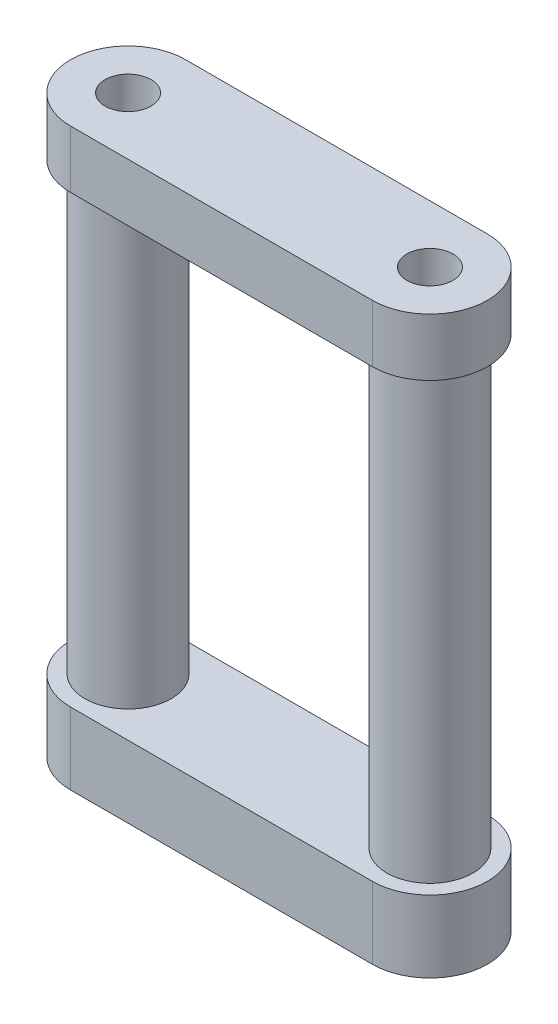
ISO-10303-21;
HEADER;
FILE_DESCRIPTION(('STEP AP214'),'2;1');
FILE_NAME('part.step','',(''),(''),'','','');
FILE_SCHEMA(('AUTOMOTIVE_DESIGN { 1 0 10303 214 1 1 1 1 }'));
ENDSEC;
DATA;
#1=APPLICATION_CONTEXT('core data for automotive mechanical design processes');
#2=APPLICATION_PROTOCOL_DEFINITION('international standard','automotive_design',2000,#1);
#3=PRODUCT_CONTEXT('',#1,'mechanical');
#4=PRODUCT('Part','Part','',(#3));
#5=PRODUCT_RELATED_PRODUCT_CATEGORY('part','',(#4));
#6=PRODUCT_DEFINITION_FORMATION('','',#4);
#7=PRODUCT_DEFINITION_CONTEXT('part definition',#1,'design');
#8=PRODUCT_DEFINITION('design','',#6,#7);
#9=PRODUCT_DEFINITION_SHAPE('','',#8);
#10=(LENGTH_UNIT() NAMED_UNIT(*) SI_UNIT(.MILLI.,.METRE.));
#11=(NAMED_UNIT(*) PLANE_ANGLE_UNIT() SI_UNIT($,.RADIAN.));
#12=(NAMED_UNIT(*) SI_UNIT($,.STERADIAN.) SOLID_ANGLE_UNIT());
#13=UNCERTAINTY_MEASURE_WITH_UNIT(LENGTH_MEASURE(1.E-05),#10,'distance_accuracy_value','');
#14=(GEOMETRIC_REPRESENTATION_CONTEXT(3) GLOBAL_UNCERTAINTY_ASSIGNED_CONTEXT((#13)) GLOBAL_UNIT_ASSIGNED_CONTEXT((#10,
#11,#12)) REPRESENTATION_CONTEXT('',''));
#15=CARTESIAN_POINT('',(0.,0.,0.));
#16=DIRECTION('',(0.,0.,1.));
#17=DIRECTION('',(1.,0.,0.));
#18=AXIS2_PLACEMENT_3D('',#15,#16,#17);
#19=CARTESIAN_POINT('',(-10.5,40.,0.));
#20=DIRECTION('',(0.,1.,0.));
#21=DIRECTION('',(0.,0.,1.));
#22=AXIS2_PLACEMENT_3D('',#19,#20,#21);
#23=PLANE('',#22);
#24=CARTESIAN_POINT('',(10.5,40.,0.));
#25=DIRECTION('',(0.,1.,0.));
#26=DIRECTION('',(0.,0.,1.));
#27=AXIS2_PLACEMENT_3D('',#24,#25,#26);
#28=CIRCLE('',#27,1.6);
#29=CARTESIAN_POINT('',(10.5,40.,1.6));
#30=VERTEX_POINT('',#29);
#31=EDGE_CURVE('E111',#30,#30,#28,.T.);
#32=ORIENTED_EDGE('',*,*,#31,.F.);
#33=EDGE_LOOP('',(#32));
#34=FACE_BOUND('',#33,.T.);
#35=CARTESIAN_POINT('',(-10.5,40.,0.));
#36=DIRECTION('',(0.,1.,0.));
#37=DIRECTION('',(0.,0.,1.));
#38=AXIS2_PLACEMENT_3D('',#35,#36,#37);
#39=CIRCLE('',#38,4.);
#40=CARTESIAN_POINT('',(-10.5,40.,-4.));
#41=VERTEX_POINT('',#40);
#42=CARTESIAN_POINT('',(-10.5,40.,4.));
#43=VERTEX_POINT('',#42);
#44=EDGE_CURVE('E96',#41,#43,#39,.T.);
#45=ORIENTED_EDGE('',*,*,#44,.T.);
#46=DIRECTION('',(1.,0.,0.));
#47=VECTOR('',#46,1.);
#48=CARTESIAN_POINT('',(-10.5,40.,4.));
#49=LINE('',#48,#47);
#50=CARTESIAN_POINT('',(10.5,40.,4.));
#51=VERTEX_POINT('',#50);
#52=EDGE_CURVE('E91',#43,#51,#49,.T.);
#53=ORIENTED_EDGE('',*,*,#52,.T.);
#54=CARTESIAN_POINT('',(10.5,40.,0.));
#55=DIRECTION('',(0.,1.,0.));
#56=DIRECTION('',(0.,0.,1.));
#57=AXIS2_PLACEMENT_3D('',#54,#55,#56);
#58=CIRCLE('',#57,4.);
#59=CARTESIAN_POINT('',(10.5,40.,-4.00000000000001));
#60=VERTEX_POINT('',#59);
#61=EDGE_CURVE('E94',#51,#60,#58,.T.);
#62=ORIENTED_EDGE('',*,*,#61,.T.);
#63=DIRECTION('',(-1.,0.,0.));
#64=VECTOR('',#63,1.);
#65=CARTESIAN_POINT('',(10.5,40.,-4.00000000000001));
#66=LINE('',#65,#64);
#67=EDGE_CURVE('E61',#60,#41,#66,.T.);
#68=ORIENTED_EDGE('',*,*,#67,.T.);
#69=EDGE_LOOP('',(#45,#53,#62,#68));
#70=FACE_BOUND('',#69,.T.);
#71=CARTESIAN_POINT('',(-10.5,40.,0.));
#72=DIRECTION('',(0.,1.,0.));
#73=DIRECTION('',(0.,0.,1.));
#74=AXIS2_PLACEMENT_3D('',#71,#72,#73);
#75=CIRCLE('',#74,1.6);
#76=CARTESIAN_POINT('',(-10.5,40.,1.6));
#77=VERTEX_POINT('',#76);
#78=EDGE_CURVE('E126',#77,#77,#75,.T.);
#79=ORIENTED_EDGE('',*,*,#78,.F.);
#80=EDGE_LOOP('',(#79));
#81=FACE_BOUND('',#80,.T.);
#82=ADVANCED_FACE('F44',(#34,#70,#81),#23,.T.);
#83=CARTESIAN_POINT('',(-10.5,36.,0.));
#84=DIRECTION('',(0.,1.,0.));
#85=DIRECTION('',(0.,0.,1.));
#86=AXIS2_PLACEMENT_3D('',#83,#84,#85);
#87=PLANE('',#86);
#88=CARTESIAN_POINT('',(-10.5,36.,0.));
#89=DIRECTION('',(0.,1.,0.));
#90=DIRECTION('',(0.,0.,1.));
#91=AXIS2_PLACEMENT_3D('',#88,#89,#90);
#92=CIRCLE('',#91,4.);
#93=CARTESIAN_POINT('',(-10.5,36.,-4.));
#94=VERTEX_POINT('',#93);
#95=CARTESIAN_POINT('',(-10.5,36.,4.));
#96=VERTEX_POINT('',#95);
#97=EDGE_CURVE('E108',#94,#96,#92,.T.);
#98=ORIENTED_EDGE('',*,*,#97,.F.);
#99=DIRECTION('',(-1.,0.,0.));
#100=VECTOR('',#99,1.);
#101=CARTESIAN_POINT('',(10.5,36.,-4.00000000000001));
#102=LINE('',#101,#100);
#103=CARTESIAN_POINT('',(10.5,36.,-4.00000000000001));
#104=VERTEX_POINT('',#103);
#105=EDGE_CURVE('E84',#104,#94,#102,.T.);
#106=ORIENTED_EDGE('',*,*,#105,.F.);
#107=CARTESIAN_POINT('',(10.5,36.,0.));
#108=DIRECTION('',(0.,1.,0.));
#109=DIRECTION('',(0.,0.,1.));
#110=AXIS2_PLACEMENT_3D('',#107,#108,#109);
#111=CIRCLE('',#110,4.);
#112=CARTESIAN_POINT('',(10.5,36.,4.));
#113=VERTEX_POINT('',#112);
#114=EDGE_CURVE('E78',#113,#104,#111,.T.);
#115=ORIENTED_EDGE('',*,*,#114,.F.);
#116=DIRECTION('',(1.,0.,0.));
#117=VECTOR('',#116,1.);
#118=CARTESIAN_POINT('',(-10.5,36.,4.));
#119=LINE('',#118,#117);
#120=EDGE_CURVE('E100',#96,#113,#119,.T.);
#121=ORIENTED_EDGE('',*,*,#120,.F.);
#122=EDGE_LOOP('',(#98,#106,#115,#121));
#123=FACE_BOUND('',#122,.T.);
#124=CARTESIAN_POINT('',(10.5,36.,0.));
#125=DIRECTION('',(0.,1.,0.));
#126=DIRECTION('',(0.,0.,1.));
#127=AXIS2_PLACEMENT_3D('',#124,#125,#126);
#128=CIRCLE('',#127,1.6);
#129=CARTESIAN_POINT('',(10.5,36.,1.6));
#130=VERTEX_POINT('',#129);
#131=EDGE_CURVE('E123',#130,#130,#128,.T.);
#132=ORIENTED_EDGE('',*,*,#131,.T.);
#133=EDGE_LOOP('',(#132));
#134=FACE_BOUND('',#133,.T.);
#135=CARTESIAN_POINT('',(-10.5,36.,0.));
#136=DIRECTION('',(0.,1.,0.));
#137=DIRECTION('',(0.,0.,1.));
#138=AXIS2_PLACEMENT_3D('',#135,#136,#137);
#139=CIRCLE('',#138,1.6);
#140=CARTESIAN_POINT('',(-10.5,36.,1.6));
#141=VERTEX_POINT('',#140);
#142=EDGE_CURVE('E129',#141,#141,#139,.T.);
#143=ORIENTED_EDGE('',*,*,#142,.T.);
#144=EDGE_LOOP('',(#143));
#145=FACE_BOUND('',#144,.T.);
#146=ADVANCED_FACE('F119',(#123,#134,#145),#87,.F.);
#147=CARTESIAN_POINT('',(-10.5,40.,0.));
#148=DIRECTION('',(0.,-1.,0.));
#149=DIRECTION('',(0.,0.,-1.));
#150=AXIS2_PLACEMENT_3D('',#147,#148,#149);
#151=CYLINDRICAL_SURFACE('',#150,4.);
#152=ORIENTED_EDGE('',*,*,#97,.T.);
#153=DIRECTION('',(0.,-1.,0.));
#154=VECTOR('',#153,1.);
#155=CARTESIAN_POINT('',(-10.5,40.,4.));
#156=LINE('',#155,#154);
#157=EDGE_CURVE('E12',#43,#96,#156,.T.);
#158=ORIENTED_EDGE('',*,*,#157,.F.);
#159=ORIENTED_EDGE('',*,*,#44,.F.);
#160=DIRECTION('',(0.,-1.,0.));
#161=VECTOR('',#160,1.);
#162=CARTESIAN_POINT('',(-10.5,40.,-4.));
#163=LINE('',#162,#161);
#164=EDGE_CURVE('E104',#41,#94,#163,.T.);
#165=ORIENTED_EDGE('',*,*,#164,.T.);
#166=EDGE_LOOP('',(#152,#158,#159,#165));
#167=FACE_BOUND('',#166,.T.);
#168=ADVANCED_FACE('F46',(#167),#151,.T.);
#169=CARTESIAN_POINT('',(-10.5,40.,4.));
#170=DIRECTION('',(0.,0.,-1.));
#171=DIRECTION('',(-1.,0.,0.));
#172=AXIS2_PLACEMENT_3D('',#169,#170,#171);
#173=PLANE('',#172);
#174=ORIENTED_EDGE('',*,*,#120,.T.);
#175=DIRECTION('',(0.,-1.,0.));
#176=VECTOR('',#175,1.);
#177=CARTESIAN_POINT('',(10.5,40.,4.));
#178=LINE('',#177,#176);
#179=EDGE_CURVE('E53',#51,#113,#178,.T.);
#180=ORIENTED_EDGE('',*,*,#179,.F.);
#181=ORIENTED_EDGE('',*,*,#52,.F.);
#182=ORIENTED_EDGE('',*,*,#157,.T.);
#183=EDGE_LOOP('',(#174,#180,#181,#182));
#184=FACE_BOUND('',#183,.T.);
#185=ADVANCED_FACE('F99',(#184),#173,.F.);
#186=CARTESIAN_POINT('',(10.5,40.,0.));
#187=DIRECTION('',(0.,-1.,0.));
#188=DIRECTION('',(0.,0.,-1.));
#189=AXIS2_PLACEMENT_3D('',#186,#187,#188);
#190=CYLINDRICAL_SURFACE('',#189,4.);
#191=ORIENTED_EDGE('',*,*,#114,.T.);
#192=DIRECTION('',(0.,-1.,0.));
#193=VECTOR('',#192,1.);
#194=CARTESIAN_POINT('',(10.5,40.,-4.00000000000001));
#195=LINE('',#194,#193);
#196=EDGE_CURVE('E101',#60,#104,#195,.T.);
#197=ORIENTED_EDGE('',*,*,#196,.F.);
#198=ORIENTED_EDGE('',*,*,#61,.F.);
#199=ORIENTED_EDGE('',*,*,#179,.T.);
#200=EDGE_LOOP('',(#191,#197,#198,#199));
#201=FACE_BOUND('',#200,.T.);
#202=ADVANCED_FACE('F102',(#201),#190,.T.);
#203=CARTESIAN_POINT('',(10.5,40.,-4.00000000000001));
#204=DIRECTION('',(0.,0.,1.));
#205=DIRECTION('',(1.,0.,0.));
#206=AXIS2_PLACEMENT_3D('',#203,#204,#205);
#207=PLANE('',#206);
#208=ORIENTED_EDGE('',*,*,#105,.T.);
#209=ORIENTED_EDGE('',*,*,#164,.F.);
#210=ORIENTED_EDGE('',*,*,#67,.F.);
#211=ORIENTED_EDGE('',*,*,#196,.T.);
#212=EDGE_LOOP('',(#208,#209,#210,#211));
#213=FACE_BOUND('',#212,.T.);
#214=ADVANCED_FACE('F116',(#213),#207,.F.);
#215=CARTESIAN_POINT('',(10.5,40.,0.));
#216=DIRECTION('',(0.,-1.,0.));
#217=DIRECTION('',(0.,0.,-1.));
#218=AXIS2_PLACEMENT_3D('',#215,#216,#217);
#219=CYLINDRICAL_SURFACE('',#218,1.6);
#220=ORIENTED_EDGE('',*,*,#31,.T.);
#221=EDGE_LOOP('',(#220));
#222=FACE_BOUND('',#221,.T.);
#223=ORIENTED_EDGE('',*,*,#131,.F.);
#224=EDGE_LOOP('',(#223));
#225=FACE_BOUND('',#224,.T.);
#226=ADVANCED_FACE('F146',(#222,#225),#219,.F.);
#227=CARTESIAN_POINT('',(-10.5,40.,0.));
#228=DIRECTION('',(0.,-1.,0.));
#229=DIRECTION('',(0.,0.,-1.));
#230=AXIS2_PLACEMENT_3D('',#227,#228,#229);
#231=CYLINDRICAL_SURFACE('',#230,1.6);
#232=ORIENTED_EDGE('',*,*,#78,.T.);
#233=EDGE_LOOP('',(#232));
#234=FACE_BOUND('',#233,.T.);
#235=ORIENTED_EDGE('',*,*,#142,.F.);
#236=EDGE_LOOP('',(#235));
#237=FACE_BOUND('',#236,.T.);
#238=ADVANCED_FACE('F135',(#234,#237),#231,.F.);
#239=CLOSED_SHELL('',(#82,#146,#168,#185,#202,#214,#226,#238));
#240=MANIFOLD_SOLID_BREP('B2',#239);
#241=CARTESIAN_POINT('',(10.5,36.,0.));
#242=DIRECTION('',(0.,1.,0.));
#243=DIRECTION('',(0.,0.,1.));
#244=AXIS2_PLACEMENT_3D('',#241,#242,#243);
#245=PLANE('',#244);
#246=CARTESIAN_POINT('',(10.5,36.,0.));
#247=DIRECTION('',(0.,1.,0.));
#248=DIRECTION('',(0.,0.,1.));
#249=AXIS2_PLACEMENT_3D('',#246,#247,#248);
#250=CIRCLE('',#249,3.);
#251=CARTESIAN_POINT('',(10.5,36.,3.));
#252=VERTEX_POINT('',#251);
#253=EDGE_CURVE('E43',#252,#252,#250,.T.);
#254=ORIENTED_EDGE('',*,*,#253,.T.);
#255=EDGE_LOOP('',(#254));
#256=FACE_BOUND('',#255,.T.);
#257=CARTESIAN_POINT('',(10.5,36.,0.));
#258=DIRECTION('',(0.,1.,0.));
#259=DIRECTION('',(0.,0.,1.));
#260=AXIS2_PLACEMENT_3D('',#257,#258,#259);
#261=CIRCLE('',#260,1.6);
#262=CARTESIAN_POINT('',(10.5,36.,1.6));
#263=VERTEX_POINT('',#262);
#264=EDGE_CURVE('E228',#263,#263,#261,.T.);
#265=ORIENTED_EDGE('',*,*,#264,.F.);
#266=EDGE_LOOP('',(#265));
#267=FACE_BOUND('',#266,.T.);
#268=ADVANCED_FACE('F217',(#256,#267),#245,.T.);
#269=CARTESIAN_POINT('',(10.5,5.,0.));
#270=DIRECTION('',(0.,1.,0.));
#271=DIRECTION('',(0.,0.,1.));
#272=AXIS2_PLACEMENT_3D('',#269,#270,#271);
#273=PLANE('',#272);
#274=CARTESIAN_POINT('',(10.5,5.,0.));
#275=DIRECTION('',(0.,1.,0.));
#276=DIRECTION('',(0.,0.,1.));
#277=AXIS2_PLACEMENT_3D('',#274,#275,#276);
#278=CIRCLE('',#277,3.);
#279=CARTESIAN_POINT('',(10.5,5.,3.));
#280=VERTEX_POINT('',#279);
#281=EDGE_CURVE('E221',#280,#280,#278,.T.);
#282=ORIENTED_EDGE('',*,*,#281,.F.);
#283=EDGE_LOOP('',(#282));
#284=FACE_BOUND('',#283,.T.);
#285=CARTESIAN_POINT('',(10.5,5.,0.));
#286=DIRECTION('',(0.,1.,0.));
#287=DIRECTION('',(0.,0.,1.));
#288=AXIS2_PLACEMENT_3D('',#285,#286,#287);
#289=CIRCLE('',#288,1.6);
#290=CARTESIAN_POINT('',(10.5,5.,1.6));
#291=VERTEX_POINT('',#290);
#292=EDGE_CURVE('E230',#291,#291,#289,.T.);
#293=ORIENTED_EDGE('',*,*,#292,.T.);
#294=EDGE_LOOP('',(#293));
#295=FACE_BOUND('',#294,.T.);
#296=ADVANCED_FACE('F240',(#284,#295),#273,.F.);
#297=CARTESIAN_POINT('',(10.5,36.,0.));
#298=DIRECTION('',(0.,-1.,0.));
#299=DIRECTION('',(0.,0.,-1.));
#300=AXIS2_PLACEMENT_3D('',#297,#298,#299);
#301=CYLINDRICAL_SURFACE('',#300,3.);
#302=ORIENTED_EDGE('',*,*,#253,.F.);
#303=EDGE_LOOP('',(#302));
#304=FACE_BOUND('',#303,.T.);
#305=ORIENTED_EDGE('',*,*,#281,.T.);
#306=EDGE_LOOP('',(#305));
#307=FACE_BOUND('',#306,.T.);
#308=ADVANCED_FACE('F219',(#304,#307),#301,.T.);
#309=CARTESIAN_POINT('',(10.5,36.,0.));
#310=DIRECTION('',(0.,-1.,0.));
#311=DIRECTION('',(0.,0.,-1.));
#312=AXIS2_PLACEMENT_3D('',#309,#310,#311);
#313=CYLINDRICAL_SURFACE('',#312,1.6);
#314=ORIENTED_EDGE('',*,*,#264,.T.);
#315=EDGE_LOOP('',(#314));
#316=FACE_BOUND('',#315,.T.);
#317=ORIENTED_EDGE('',*,*,#292,.F.);
#318=EDGE_LOOP('',(#317));
#319=FACE_BOUND('',#318,.T.);
#320=ADVANCED_FACE('F236',(#316,#319),#313,.F.);
#321=CLOSED_SHELL('',(#268,#296,#308,#320));
#322=MANIFOLD_SOLID_BREP('B6',#321);
#323=CARTESIAN_POINT('',(-10.5,36.,0.));
#324=DIRECTION('',(0.,1.,0.));
#325=DIRECTION('',(0.,0.,1.));
#326=AXIS2_PLACEMENT_3D('',#323,#324,#325);
#327=PLANE('',#326);
#328=CARTESIAN_POINT('',(-10.5,36.,0.));
#329=DIRECTION('',(0.,1.,0.));
#330=DIRECTION('',(0.,0.,1.));
#331=AXIS2_PLACEMENT_3D('',#328,#329,#330);
#332=CIRCLE('',#331,3.);
#333=CARTESIAN_POINT('',(-10.5,36.,3.));
#334=VERTEX_POINT('',#333);
#335=EDGE_CURVE('E216',#334,#334,#332,.T.);
#336=ORIENTED_EDGE('',*,*,#335,.T.);
#337=EDGE_LOOP('',(#336));
#338=FACE_BOUND('',#337,.T.);
#339=CARTESIAN_POINT('',(-10.5,36.,0.));
#340=DIRECTION('',(0.,1.,0.));
#341=DIRECTION('',(0.,0.,1.));
#342=AXIS2_PLACEMENT_3D('',#339,#340,#341);
#343=CIRCLE('',#342,1.6);
#344=CARTESIAN_POINT('',(-10.5,36.,1.6));
#345=VERTEX_POINT('',#344);
#346=EDGE_CURVE('E298',#345,#345,#343,.T.);
#347=ORIENTED_EDGE('',*,*,#346,.F.);
#348=EDGE_LOOP('',(#347));
#349=FACE_BOUND('',#348,.T.);
#350=ADVANCED_FACE('F287',(#338,#349),#327,.T.);
#351=CARTESIAN_POINT('',(-10.5,5.,0.));
#352=DIRECTION('',(0.,1.,0.));
#353=DIRECTION('',(0.,0.,1.));
#354=AXIS2_PLACEMENT_3D('',#351,#352,#353);
#355=PLANE('',#354);
#356=CARTESIAN_POINT('',(-10.5,5.,0.));
#357=DIRECTION('',(0.,1.,0.));
#358=DIRECTION('',(0.,0.,1.));
#359=AXIS2_PLACEMENT_3D('',#356,#357,#358);
#360=CIRCLE('',#359,3.);
#361=CARTESIAN_POINT('',(-10.5,5.,3.));
#362=VERTEX_POINT('',#361);
#363=EDGE_CURVE('E291',#362,#362,#360,.T.);
#364=ORIENTED_EDGE('',*,*,#363,.F.);
#365=EDGE_LOOP('',(#364));
#366=FACE_BOUND('',#365,.T.);
#367=CARTESIAN_POINT('',(-10.5,5.,0.));
#368=DIRECTION('',(0.,1.,0.));
#369=DIRECTION('',(0.,0.,1.));
#370=AXIS2_PLACEMENT_3D('',#367,#368,#369);
#371=CIRCLE('',#370,1.6);
#372=CARTESIAN_POINT('',(-10.5,5.,1.6));
#373=VERTEX_POINT('',#372);
#374=EDGE_CURVE('E300',#373,#373,#371,.T.);
#375=ORIENTED_EDGE('',*,*,#374,.T.);
#376=EDGE_LOOP('',(#375));
#377=FACE_BOUND('',#376,.T.);
#378=ADVANCED_FACE('F310',(#366,#377),#355,.F.);
#379=CARTESIAN_POINT('',(-10.5,36.,0.));
#380=DIRECTION('',(0.,-1.,0.));
#381=DIRECTION('',(0.,0.,-1.));
#382=AXIS2_PLACEMENT_3D('',#379,#380,#381);
#383=CYLINDRICAL_SURFACE('',#382,3.);
#384=ORIENTED_EDGE('',*,*,#335,.F.);
#385=EDGE_LOOP('',(#384));
#386=FACE_BOUND('',#385,.T.);
#387=ORIENTED_EDGE('',*,*,#363,.T.);
#388=EDGE_LOOP('',(#387));
#389=FACE_BOUND('',#388,.T.);
#390=ADVANCED_FACE('F289',(#386,#389),#383,.T.);
#391=CARTESIAN_POINT('',(-10.5,36.,0.));
#392=DIRECTION('',(0.,-1.,0.));
#393=DIRECTION('',(0.,0.,-1.));
#394=AXIS2_PLACEMENT_3D('',#391,#392,#393);
#395=CYLINDRICAL_SURFACE('',#394,1.6);
#396=ORIENTED_EDGE('',*,*,#346,.T.);
#397=EDGE_LOOP('',(#396));
#398=FACE_BOUND('',#397,.T.);
#399=ORIENTED_EDGE('',*,*,#374,.F.);
#400=EDGE_LOOP('',(#399));
#401=FACE_BOUND('',#400,.T.);
#402=ADVANCED_FACE('F306',(#398,#401),#395,.F.);
#403=CLOSED_SHELL('',(#350,#378,#390,#402));
#404=MANIFOLD_SOLID_BREP('B38',#403);
#405=CARTESIAN_POINT('',(-10.5,5.,0.));
#406=DIRECTION('',(0.,1.,0.));
#407=DIRECTION('',(0.,0.,1.));
#408=AXIS2_PLACEMENT_3D('',#405,#406,#407);
#409=PLANE('',#408);
#410=CARTESIAN_POINT('',(-10.5,5.,0.));
#411=DIRECTION('',(0.,1.,0.));
#412=DIRECTION('',(0.,0.,1.));
#413=AXIS2_PLACEMENT_3D('',#410,#411,#412);
#414=CIRCLE('',#413,1.5);
#415=CARTESIAN_POINT('',(-10.5,5.,1.5));
#416=VERTEX_POINT('',#415);
#417=EDGE_CURVE('E415',#416,#416,#414,.T.);
#418=ORIENTED_EDGE('',*,*,#417,.F.);
#419=EDGE_LOOP('',(#418));
#420=FACE_BOUND('',#419,.T.);
#421=CARTESIAN_POINT('',(-10.5,5.,0.));
#422=DIRECTION('',(0.,1.,0.));
#423=DIRECTION('',(0.,0.,1.));
#424=AXIS2_PLACEMENT_3D('',#421,#422,#423);
#425=CIRCLE('',#424,4.);
#426=CARTESIAN_POINT('',(-10.5,5.,-4.));
#427=VERTEX_POINT('',#426);
#428=CARTESIAN_POINT('',(-10.5,5.,4.));
#429=VERTEX_POINT('',#428);
#430=EDGE_CURVE('E400',#427,#429,#425,.T.);
#431=ORIENTED_EDGE('',*,*,#430,.T.);
#432=DIRECTION('',(1.,0.,0.));
#433=VECTOR('',#432,1.);
#434=CARTESIAN_POINT('',(-10.5,5.,4.));
#435=LINE('',#434,#433);
#436=CARTESIAN_POINT('',(10.5,5.,4.));
#437=VERTEX_POINT('',#436);
#438=EDGE_CURVE('E395',#429,#437,#435,.T.);
#439=ORIENTED_EDGE('',*,*,#438,.T.);
#440=CARTESIAN_POINT('',(10.5,5.,0.));
#441=DIRECTION('',(0.,1.,0.));
#442=DIRECTION('',(0.,0.,1.));
#443=AXIS2_PLACEMENT_3D('',#440,#441,#442);
#444=CIRCLE('',#443,4.);
#445=CARTESIAN_POINT('',(10.5,5.,-4.00000000000001));
#446=VERTEX_POINT('',#445);
#447=EDGE_CURVE('E398',#437,#446,#444,.T.);
#448=ORIENTED_EDGE('',*,*,#447,.T.);
#449=DIRECTION('',(-1.,0.,0.));
#450=VECTOR('',#449,1.);
#451=CARTESIAN_POINT('',(-10.5,5.,-4.));
#452=LINE('',#451,#450);
#453=EDGE_CURVE('E365',#446,#427,#452,.T.);
#454=ORIENTED_EDGE('',*,*,#453,.T.);
#455=EDGE_LOOP('',(#431,#439,#448,#454));
#456=FACE_BOUND('',#455,.T.);
#457=CARTESIAN_POINT('',(10.5,5.,0.));
#458=DIRECTION('',(0.,1.,0.));
#459=DIRECTION('',(0.,0.,1.));
#460=AXIS2_PLACEMENT_3D('',#457,#458,#459);
#461=CIRCLE('',#460,1.5);
#462=CARTESIAN_POINT('',(10.5,5.,1.49999999999999));
#463=VERTEX_POINT('',#462);
#464=EDGE_CURVE('E430',#463,#463,#461,.T.);
#465=ORIENTED_EDGE('',*,*,#464,.F.);
#466=EDGE_LOOP('',(#465));
#467=FACE_BOUND('',#466,.T.);
#468=ADVANCED_FACE('F348',(#420,#456,#467),#409,.T.);
#469=CARTESIAN_POINT('',(-10.5,0.,0.));
#470=DIRECTION('',(0.,1.,0.));
#471=DIRECTION('',(0.,0.,1.));
#472=AXIS2_PLACEMENT_3D('',#469,#470,#471);
#473=PLANE('',#472);
#474=CARTESIAN_POINT('',(-10.5,0.,0.));
#475=DIRECTION('',(0.,1.,0.));
#476=DIRECTION('',(0.,0.,1.));
#477=AXIS2_PLACEMENT_3D('',#474,#475,#476);
#478=CIRCLE('',#477,4.);
#479=CARTESIAN_POINT('',(-10.5,0.,-4.));
#480=VERTEX_POINT('',#479);
#481=CARTESIAN_POINT('',(-10.5,0.,4.));
#482=VERTEX_POINT('',#481);
#483=EDGE_CURVE('E412',#480,#482,#478,.T.);
#484=ORIENTED_EDGE('',*,*,#483,.F.);
#485=DIRECTION('',(-1.,0.,0.));
#486=VECTOR('',#485,1.);
#487=CARTESIAN_POINT('',(-10.5,0.,-4.));
#488=LINE('',#487,#486);
#489=CARTESIAN_POINT('',(10.5,0.,-4.00000000000001));
#490=VERTEX_POINT('',#489);
#491=EDGE_CURVE('E388',#490,#480,#488,.T.);
#492=ORIENTED_EDGE('',*,*,#491,.F.);
#493=CARTESIAN_POINT('',(10.5,0.,0.));
#494=DIRECTION('',(0.,1.,0.));
#495=DIRECTION('',(0.,0.,1.));
#496=AXIS2_PLACEMENT_3D('',#493,#494,#495);
#497=CIRCLE('',#496,4.);
#498=CARTESIAN_POINT('',(10.5,0.,4.));
#499=VERTEX_POINT('',#498);
#500=EDGE_CURVE('E382',#499,#490,#497,.T.);
#501=ORIENTED_EDGE('',*,*,#500,.F.);
#502=DIRECTION('',(1.,0.,0.));
#503=VECTOR('',#502,1.);
#504=CARTESIAN_POINT('',(-10.5,0.,4.));
#505=LINE('',#504,#503);
#506=EDGE_CURVE('E404',#482,#499,#505,.T.);
#507=ORIENTED_EDGE('',*,*,#506,.F.);
#508=EDGE_LOOP('',(#484,#492,#501,#507));
#509=FACE_BOUND('',#508,.T.);
#510=CARTESIAN_POINT('',(-10.5,0.,0.));
#511=DIRECTION('',(0.,1.,0.));
#512=DIRECTION('',(0.,0.,1.));
#513=AXIS2_PLACEMENT_3D('',#510,#511,#512);
#514=CIRCLE('',#513,1.5);
#515=CARTESIAN_POINT('',(-10.5,0.,1.5));
#516=VERTEX_POINT('',#515);
#517=EDGE_CURVE('E427',#516,#516,#514,.T.);
#518=ORIENTED_EDGE('',*,*,#517,.T.);
#519=EDGE_LOOP('',(#518));
#520=FACE_BOUND('',#519,.T.);
#521=CARTESIAN_POINT('',(10.5,0.,0.));
#522=DIRECTION('',(0.,1.,0.));
#523=DIRECTION('',(0.,0.,1.));
#524=AXIS2_PLACEMENT_3D('',#521,#522,#523);
#525=CIRCLE('',#524,1.5);
#526=CARTESIAN_POINT('',(10.5,0.,1.49999999999999));
#527=VERTEX_POINT('',#526);
#528=EDGE_CURVE('E433',#527,#527,#525,.T.);
#529=ORIENTED_EDGE('',*,*,#528,.T.);
#530=EDGE_LOOP('',(#529));
#531=FACE_BOUND('',#530,.T.);
#532=ADVANCED_FACE('F423',(#509,#520,#531),#473,.F.);
#533=CARTESIAN_POINT('',(-10.5,5.,0.));
#534=DIRECTION('',(0.,-1.,0.));
#535=DIRECTION('',(0.,0.,-1.));
#536=AXIS2_PLACEMENT_3D('',#533,#534,#535);
#537=CYLINDRICAL_SURFACE('',#536,4.);
#538=ORIENTED_EDGE('',*,*,#483,.T.);
#539=DIRECTION('',(0.,-1.,0.));
#540=VECTOR('',#539,1.);
#541=CARTESIAN_POINT('',(-10.5,5.,4.));
#542=LINE('',#541,#540);
#543=EDGE_CURVE('E285',#429,#482,#542,.T.);
#544=ORIENTED_EDGE('',*,*,#543,.F.);
#545=ORIENTED_EDGE('',*,*,#430,.F.);
#546=DIRECTION('',(0.,-1.,0.));
#547=VECTOR('',#546,1.);
#548=CARTESIAN_POINT('',(-10.5,5.,-4.));
#549=LINE('',#548,#547);
#550=EDGE_CURVE('E408',#427,#480,#549,.T.);
#551=ORIENTED_EDGE('',*,*,#550,.T.);
#552=EDGE_LOOP('',(#538,#544,#545,#551));
#553=FACE_BOUND('',#552,.T.);
#554=ADVANCED_FACE('F350',(#553),#537,.T.);
#555=CARTESIAN_POINT('',(-10.5,5.,4.));
#556=DIRECTION('',(0.,0.,-1.));
#557=DIRECTION('',(-1.,0.,0.));
#558=AXIS2_PLACEMENT_3D('',#555,#556,#557);
#559=PLANE('',#558);
#560=ORIENTED_EDGE('',*,*,#506,.T.);
#561=DIRECTION('',(0.,-1.,0.));
#562=VECTOR('',#561,1.);
#563=CARTESIAN_POINT('',(10.5,5.,4.));
#564=LINE('',#563,#562);
#565=EDGE_CURVE('E357',#437,#499,#564,.T.);
#566=ORIENTED_EDGE('',*,*,#565,.F.);
#567=ORIENTED_EDGE('',*,*,#438,.F.);
#568=ORIENTED_EDGE('',*,*,#543,.T.);
#569=EDGE_LOOP('',(#560,#566,#567,#568));
#570=FACE_BOUND('',#569,.T.);
#571=ADVANCED_FACE('F403',(#570),#559,.F.);
#572=CARTESIAN_POINT('',(10.5,5.,0.));
#573=DIRECTION('',(0.,-1.,0.));
#574=DIRECTION('',(0.,0.,-1.));
#575=AXIS2_PLACEMENT_3D('',#572,#573,#574);
#576=CYLINDRICAL_SURFACE('',#575,4.);
#577=ORIENTED_EDGE('',*,*,#500,.T.);
#578=DIRECTION('',(0.,-1.,0.));
#579=VECTOR('',#578,1.);
#580=CARTESIAN_POINT('',(10.5,5.,-4.00000000000001));
#581=LINE('',#580,#579);
#582=EDGE_CURVE('E405',#446,#490,#581,.T.);
#583=ORIENTED_EDGE('',*,*,#582,.F.);
#584=ORIENTED_EDGE('',*,*,#447,.F.);
#585=ORIENTED_EDGE('',*,*,#565,.T.);
#586=EDGE_LOOP('',(#577,#583,#584,#585));
#587=FACE_BOUND('',#586,.T.);
#588=ADVANCED_FACE('F406',(#587),#576,.T.);
#589=CARTESIAN_POINT('',(-10.5,5.,-4.));
#590=DIRECTION('',(0.,0.,1.));
#591=DIRECTION('',(1.,0.,0.));
#592=AXIS2_PLACEMENT_3D('',#589,#590,#591);
#593=PLANE('',#592);
#594=ORIENTED_EDGE('',*,*,#491,.T.);
#595=ORIENTED_EDGE('',*,*,#550,.F.);
#596=ORIENTED_EDGE('',*,*,#453,.F.);
#597=ORIENTED_EDGE('',*,*,#582,.T.);
#598=EDGE_LOOP('',(#594,#595,#596,#597));
#599=FACE_BOUND('',#598,.T.);
#600=ADVANCED_FACE('F420',(#599),#593,.F.);
#601=CARTESIAN_POINT('',(-10.5,5.,0.));
#602=DIRECTION('',(0.,-1.,0.));
#603=DIRECTION('',(0.,0.,-1.));
#604=AXIS2_PLACEMENT_3D('',#601,#602,#603);
#605=CYLINDRICAL_SURFACE('',#604,1.5);
#606=ORIENTED_EDGE('',*,*,#417,.T.);
#607=EDGE_LOOP('',(#606));
#608=FACE_BOUND('',#607,.T.);
#609=ORIENTED_EDGE('',*,*,#517,.F.);
#610=EDGE_LOOP('',(#609));
#611=FACE_BOUND('',#610,.T.);
#612=ADVANCED_FACE('F450',(#608,#611),#605,.F.);
#613=CARTESIAN_POINT('',(10.5,5.,0.));
#614=DIRECTION('',(0.,-1.,0.));
#615=DIRECTION('',(0.,0.,-1.));
#616=AXIS2_PLACEMENT_3D('',#613,#614,#615);
#617=CYLINDRICAL_SURFACE('',#616,1.5);
#618=ORIENTED_EDGE('',*,*,#464,.T.);
#619=EDGE_LOOP('',(#618));
#620=FACE_BOUND('',#619,.T.);
#621=ORIENTED_EDGE('',*,*,#528,.F.);
#622=EDGE_LOOP('',(#621));
#623=FACE_BOUND('',#622,.T.);
#624=ADVANCED_FACE('F439',(#620,#623),#617,.F.);
#625=CLOSED_SHELL('',(#468,#532,#554,#571,#588,#600,#612,#624));
#626=MANIFOLD_SOLID_BREP('B211',#625);
#627=ADVANCED_BREP_SHAPE_REPRESENTATION('',(#18,#240,#322,#404,#626),#14);
#628=SHAPE_DEFINITION_REPRESENTATION(#9,#627);
ENDSEC;
END-ISO-10303-21;
